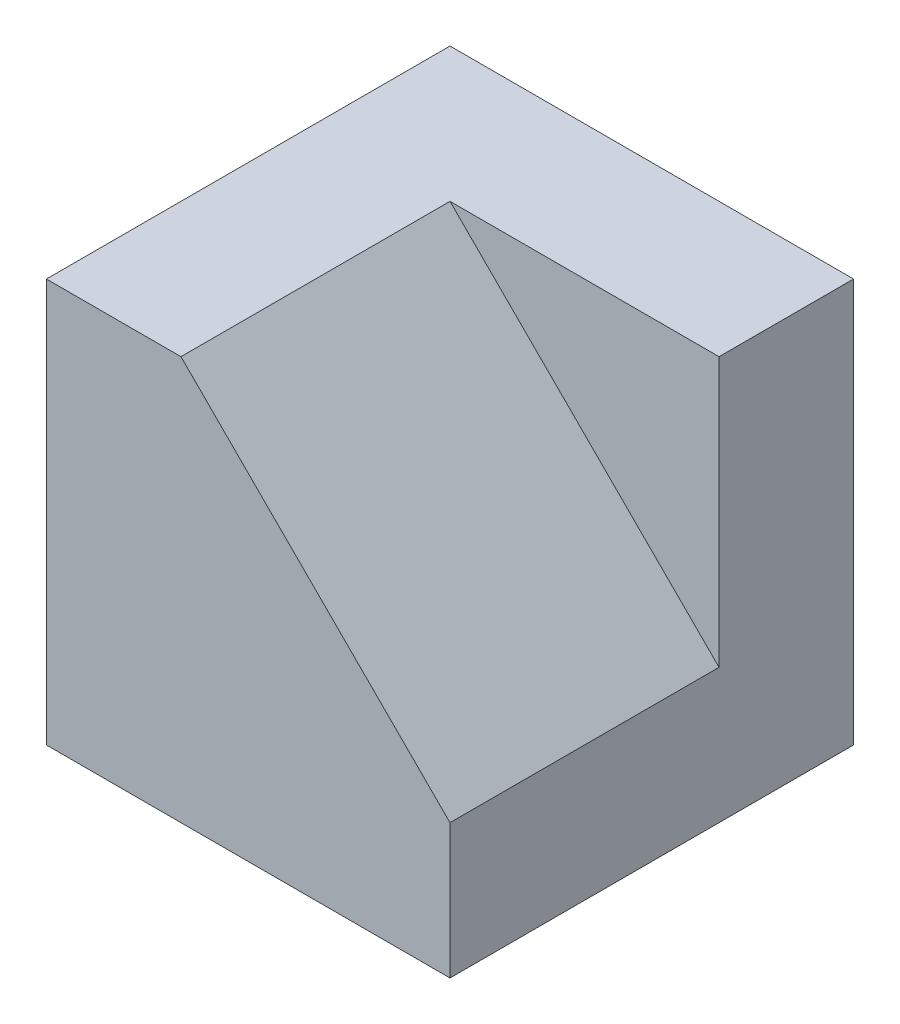
ISO-10303-21;
HEADER;
FILE_DESCRIPTION(('STEP AP214'),'2;1');
FILE_NAME('part.step','',(''),(''),'','','');
FILE_SCHEMA(('AUTOMOTIVE_DESIGN { 1 0 10303 214 1 1 1 1 }'));
ENDSEC;
DATA;
#1=APPLICATION_CONTEXT('core data for automotive mechanical design processes');
#2=APPLICATION_PROTOCOL_DEFINITION('international standard','automotive_design',2000,#1);
#3=PRODUCT_CONTEXT('',#1,'mechanical');
#4=PRODUCT('Part','Part','',(#3));
#5=PRODUCT_RELATED_PRODUCT_CATEGORY('part','',(#4));
#6=PRODUCT_DEFINITION_FORMATION('','',#4);
#7=PRODUCT_DEFINITION_CONTEXT('part definition',#1,'design');
#8=PRODUCT_DEFINITION('design','',#6,#7);
#9=PRODUCT_DEFINITION_SHAPE('','',#8);
#10=(LENGTH_UNIT() NAMED_UNIT(*) SI_UNIT(.MILLI.,.METRE.));
#11=(NAMED_UNIT(*) PLANE_ANGLE_UNIT() SI_UNIT($,.RADIAN.));
#12=(NAMED_UNIT(*) SI_UNIT($,.STERADIAN.) SOLID_ANGLE_UNIT());
#13=UNCERTAINTY_MEASURE_WITH_UNIT(LENGTH_MEASURE(1.E-05),#10,'distance_accuracy_value','');
#14=(GEOMETRIC_REPRESENTATION_CONTEXT(3) GLOBAL_UNCERTAINTY_ASSIGNED_CONTEXT((#13)) GLOBAL_UNIT_ASSIGNED_CONTEXT((#10,
#11,#12)) REPRESENTATION_CONTEXT('',''));
#15=CARTESIAN_POINT('',(0.,0.,0.));
#16=DIRECTION('',(0.,0.,1.));
#17=DIRECTION('',(1.,0.,0.));
#18=AXIS2_PLACEMENT_3D('',#15,#16,#17);
#19=CARTESIAN_POINT('',(0.,0.,40.));
#20=DIRECTION('',(1.,0.,0.));
#21=DIRECTION('',(0.,0.,-1.));
#22=AXIS2_PLACEMENT_3D('',#19,#20,#21);
#23=PLANE('',#22);
#24=DIRECTION('',(0.,0.,-1.));
#25=VECTOR('',#24,1.);
#26=CARTESIAN_POINT('',(0.,60.,40.));
#27=LINE('',#26,#25);
#28=CARTESIAN_POINT('',(0.,60.,40.));
#29=VERTEX_POINT('',#28);
#30=CARTESIAN_POINT('',(0.,60.,-20.));
#31=VERTEX_POINT('',#30);
#32=EDGE_CURVE('E147',#29,#31,#27,.T.);
#33=ORIENTED_EDGE('',*,*,#32,.T.);
#34=DIRECTION('',(0.,1.,0.));
#35=VECTOR('',#34,1.);
#36=CARTESIAN_POINT('',(0.,0.,-20.));
#37=LINE('',#36,#35);
#38=CARTESIAN_POINT('',(0.,0.,-20.));
#39=VERTEX_POINT('',#38);
#40=EDGE_CURVE('E110',#39,#31,#37,.T.);
#41=ORIENTED_EDGE('',*,*,#40,.F.);
#42=DIRECTION('',(0.,0.,-1.));
#43=VECTOR('',#42,1.);
#44=CARTESIAN_POINT('',(0.,0.,40.));
#45=LINE('',#44,#43);
#46=CARTESIAN_POINT('',(0.,0.,40.));
#47=VERTEX_POINT('',#46);
#48=EDGE_CURVE('E11',#47,#39,#45,.T.);
#49=ORIENTED_EDGE('',*,*,#48,.F.);
#50=DIRECTION('',(0.,-1.,0.));
#51=VECTOR('',#50,1.);
#52=CARTESIAN_POINT('',(0.,0.,40.));
#53=LINE('',#52,#51);
#54=EDGE_CURVE('E134',#29,#47,#53,.T.);
#55=ORIENTED_EDGE('',*,*,#54,.F.);
#56=EDGE_LOOP('',(#33,#41,#49,#55));
#57=FACE_BOUND('',#56,.T.);
#58=ADVANCED_FACE('F43',(#57),#23,.F.);
#59=CARTESIAN_POINT('',(0.,0.,40.));
#60=DIRECTION('',(0.,1.,0.));
#61=DIRECTION('',(0.,0.,1.));
#62=AXIS2_PLACEMENT_3D('',#59,#60,#61);
#63=PLANE('',#62);
#64=ORIENTED_EDGE('',*,*,#48,.T.);
#65=DIRECTION('',(-1.,0.,0.));
#66=VECTOR('',#65,1.);
#67=CARTESIAN_POINT('',(60.,0.,-20.));
#68=LINE('',#67,#66);
#69=CARTESIAN_POINT('',(60.,0.,-20.));
#70=VERTEX_POINT('',#69);
#71=EDGE_CURVE('E103',#70,#39,#68,.T.);
#72=ORIENTED_EDGE('',*,*,#71,.F.);
#73=DIRECTION('',(0.,0.,-1.));
#74=VECTOR('',#73,1.);
#75=CARTESIAN_POINT('',(60.,0.,40.));
#76=LINE('',#75,#74);
#77=CARTESIAN_POINT('',(60.,0.,40.));
#78=VERTEX_POINT('',#77);
#79=EDGE_CURVE('E52',#78,#70,#76,.T.);
#80=ORIENTED_EDGE('',*,*,#79,.F.);
#81=DIRECTION('',(1.,0.,0.));
#82=VECTOR('',#81,1.);
#83=CARTESIAN_POINT('',(0.,0.,40.));
#84=LINE('',#83,#82);
#85=EDGE_CURVE('E137',#47,#78,#84,.T.);
#86=ORIENTED_EDGE('',*,*,#85,.F.);
#87=EDGE_LOOP('',(#64,#72,#80,#86));
#88=FACE_BOUND('',#87,.T.);
#89=ADVANCED_FACE('F104',(#88),#63,.F.);
#90=CARTESIAN_POINT('',(60.,20.,40.));
#91=DIRECTION('',(-1.,0.,0.));
#92=DIRECTION('',(0.,0.,1.));
#93=AXIS2_PLACEMENT_3D('',#90,#91,#92);
#94=PLANE('',#93);
#95=ORIENTED_EDGE('',*,*,#79,.T.);
#96=DIRECTION('',(0.,-1.,0.));
#97=VECTOR('',#96,1.);
#98=CARTESIAN_POINT('',(60.,0.,-20.));
#99=LINE('',#98,#97);
#100=CARTESIAN_POINT('',(60.,60.,-20.));
#101=VERTEX_POINT('',#100);
#102=EDGE_CURVE('E96',#101,#70,#99,.T.);
#103=ORIENTED_EDGE('',*,*,#102,.F.);
#104=DIRECTION('',(0.,0.,1.));
#105=VECTOR('',#104,1.);
#106=CARTESIAN_POINT('',(60.,60.,-20.));
#107=LINE('',#106,#105);
#108=CARTESIAN_POINT('',(60.,60.,0.));
#109=VERTEX_POINT('',#108);
#110=EDGE_CURVE('E127',#101,#109,#107,.T.);
#111=ORIENTED_EDGE('',*,*,#110,.T.);
#112=DIRECTION('',(0.,-1.,0.));
#113=VECTOR('',#112,1.);
#114=CARTESIAN_POINT('',(60.,0.,0.));
#115=LINE('',#114,#113);
#116=CARTESIAN_POINT('',(60.,20.,0.));
#117=VERTEX_POINT('',#116);
#118=EDGE_CURVE('E120',#109,#117,#115,.T.);
#119=ORIENTED_EDGE('',*,*,#118,.T.);
#120=DIRECTION('',(0.,0.,-1.));
#121=VECTOR('',#120,1.);
#122=CARTESIAN_POINT('',(60.,20.,40.));
#123=LINE('',#122,#121);
#124=CARTESIAN_POINT('',(60.,20.,40.));
#125=VERTEX_POINT('',#124);
#126=EDGE_CURVE('E101',#125,#117,#123,.T.);
#127=ORIENTED_EDGE('',*,*,#126,.F.);
#128=DIRECTION('',(0.,1.,0.));
#129=VECTOR('',#128,1.);
#130=CARTESIAN_POINT('',(60.,20.,40.));
#131=LINE('',#130,#129);
#132=EDGE_CURVE('E98',#78,#125,#131,.T.);
#133=ORIENTED_EDGE('',*,*,#132,.F.);
#134=EDGE_LOOP('',(#95,#103,#111,#119,#127,#133));
#135=FACE_BOUND('',#134,.T.);
#136=ADVANCED_FACE('F93',(#135),#94,.F.);
#137=CARTESIAN_POINT('',(20.,60.,40.));
#138=DIRECTION('',(-0.707106781186548,-0.707106781186547,0.));
#139=DIRECTION('',(0.707106781186547,-0.707106781186548,0.));
#140=AXIS2_PLACEMENT_3D('',#137,#138,#139);
#141=PLANE('',#140);
#142=DIRECTION('',(-0.707106781186547,0.707106781186548,0.));
#143=VECTOR('',#142,1.);
#144=CARTESIAN_POINT('',(20.,60.,0.));
#145=LINE('',#144,#143);
#146=CARTESIAN_POINT('',(20.,60.,0.));
#147=VERTEX_POINT('',#146);
#148=EDGE_CURVE('E133',#117,#147,#145,.T.);
#149=ORIENTED_EDGE('',*,*,#148,.T.);
#150=DIRECTION('',(0.,0.,-1.));
#151=VECTOR('',#150,1.);
#152=CARTESIAN_POINT('',(20.,60.,40.));
#153=LINE('',#152,#151);
#154=CARTESIAN_POINT('',(20.,60.,40.));
#155=VERTEX_POINT('',#154);
#156=EDGE_CURVE('E153',#155,#147,#153,.T.);
#157=ORIENTED_EDGE('',*,*,#156,.F.);
#158=DIRECTION('',(-0.707106781186547,0.707106781186548,0.));
#159=VECTOR('',#158,1.);
#160=CARTESIAN_POINT('',(20.,60.,40.));
#161=LINE('',#160,#159);
#162=EDGE_CURVE('E142',#125,#155,#161,.T.);
#163=ORIENTED_EDGE('',*,*,#162,.F.);
#164=ORIENTED_EDGE('',*,*,#126,.T.);
#165=EDGE_LOOP('',(#149,#157,#163,#164));
#166=FACE_BOUND('',#165,.T.);
#167=ADVANCED_FACE('F161',(#166),#141,.F.);
#168=CARTESIAN_POINT('',(0.,60.,40.));
#169=DIRECTION('',(0.,-1.,0.));
#170=DIRECTION('',(1.,0.,0.));
#171=AXIS2_PLACEMENT_3D('',#168,#169,#170);
#172=PLANE('',#171);
#173=ORIENTED_EDGE('',*,*,#156,.T.);
#174=DIRECTION('',(1.,0.,0.));
#175=VECTOR('',#174,1.);
#176=CARTESIAN_POINT('',(60.,60.,0.));
#177=LINE('',#176,#175);
#178=EDGE_CURVE('E117',#147,#109,#177,.T.);
#179=ORIENTED_EDGE('',*,*,#178,.T.);
#180=ORIENTED_EDGE('',*,*,#110,.F.);
#181=DIRECTION('',(1.,0.,0.));
#182=VECTOR('',#181,1.);
#183=CARTESIAN_POINT('',(60.,60.,-20.));
#184=LINE('',#183,#182);
#185=EDGE_CURVE('E114',#31,#101,#184,.T.);
#186=ORIENTED_EDGE('',*,*,#185,.F.);
#187=ORIENTED_EDGE('',*,*,#32,.F.);
#188=DIRECTION('',(-1.,0.,0.));
#189=VECTOR('',#188,1.);
#190=CARTESIAN_POINT('',(0.,60.,40.));
#191=LINE('',#190,#189);
#192=EDGE_CURVE('E59',#155,#29,#191,.T.);
#193=ORIENTED_EDGE('',*,*,#192,.F.);
#194=EDGE_LOOP('',(#173,#179,#180,#186,#187,#193));
#195=FACE_BOUND('',#194,.T.);
#196=ADVANCED_FACE('F168',(#195),#172,.F.);
#197=CARTESIAN_POINT('',(0.,0.,40.));
#198=DIRECTION('',(0.,0.,-1.));
#199=DIRECTION('',(-1.,0.,0.));
#200=AXIS2_PLACEMENT_3D('',#197,#198,#199);
#201=PLANE('',#200);
#202=ORIENTED_EDGE('',*,*,#54,.T.);
#203=ORIENTED_EDGE('',*,*,#85,.T.);
#204=ORIENTED_EDGE('',*,*,#132,.T.);
#205=ORIENTED_EDGE('',*,*,#162,.T.);
#206=ORIENTED_EDGE('',*,*,#192,.T.);
#207=EDGE_LOOP('',(#202,#203,#204,#205,#206));
#208=FACE_BOUND('',#207,.T.);
#209=ADVANCED_FACE('F171',(#208),#201,.F.);
#210=CARTESIAN_POINT('',(0.,0.,0.));
#211=DIRECTION('',(0.,0.,1.));
#212=DIRECTION('',(1.,0.,0.));
#213=AXIS2_PLACEMENT_3D('',#210,#211,#212);
#214=PLANE('',#213);
#215=ORIENTED_EDGE('',*,*,#148,.F.);
#216=ORIENTED_EDGE('',*,*,#118,.F.);
#217=ORIENTED_EDGE('',*,*,#178,.F.);
#218=EDGE_LOOP('',(#215,#216,#217));
#219=FACE_BOUND('',#218,.T.);
#220=ADVANCED_FACE('F166',(#219),#214,.T.);
#221=CARTESIAN_POINT('',(0.,0.,-20.));
#222=DIRECTION('',(0.,0.,1.));
#223=DIRECTION('',(1.,0.,0.));
#224=AXIS2_PLACEMENT_3D('',#221,#222,#223);
#225=PLANE('',#224);
#226=ORIENTED_EDGE('',*,*,#102,.T.);
#227=ORIENTED_EDGE('',*,*,#71,.T.);
#228=ORIENTED_EDGE('',*,*,#40,.T.);
#229=ORIENTED_EDGE('',*,*,#185,.T.);
#230=EDGE_LOOP('',(#226,#227,#228,#229));
#231=FACE_BOUND('',#230,.T.);
#232=ADVANCED_FACE('F112',(#231),#225,.F.);
#233=CLOSED_SHELL('',(#58,#89,#136,#167,#196,#209,#220,#232));
#234=MANIFOLD_SOLID_BREP('B2',#233);
#235=ADVANCED_BREP_SHAPE_REPRESENTATION('',(#18,#234),#14);
#236=SHAPE_DEFINITION_REPRESENTATION(#9,#235);
ENDSEC;
END-ISO-10303-21;
